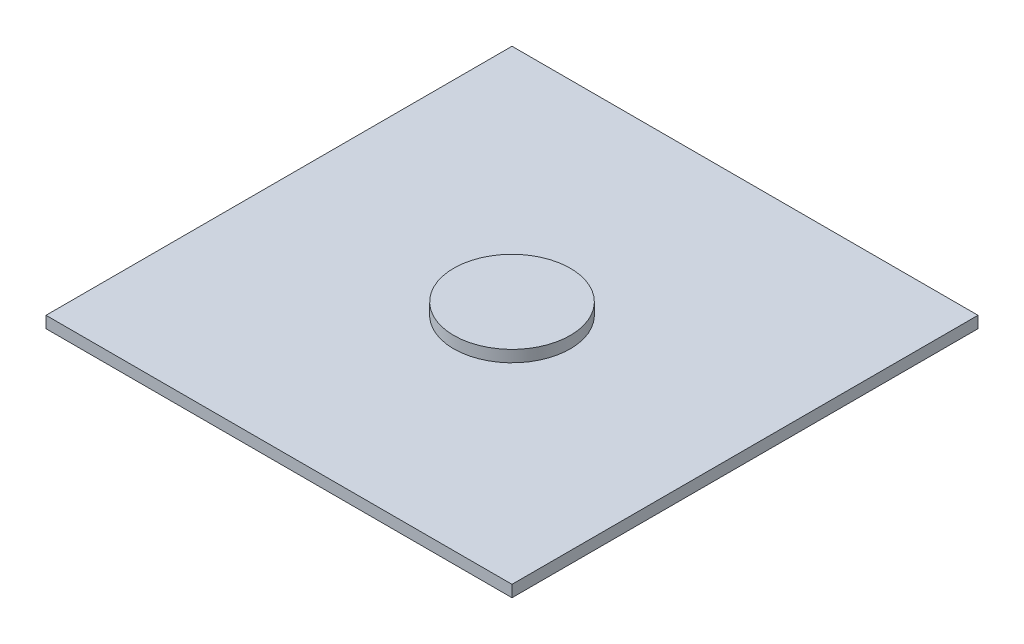
ISO-10303-21;
HEADER;
FILE_DESCRIPTION(('STEP AP214'),'2;1');
FILE_NAME('part.step','',(''),(''),'','','');
FILE_SCHEMA(('AUTOMOTIVE_DESIGN { 1 0 10303 214 1 1 1 1 }'));
ENDSEC;
DATA;
#1=APPLICATION_CONTEXT('core data for automotive mechanical design processes');
#2=APPLICATION_PROTOCOL_DEFINITION('international standard','automotive_design',2000,#1);
#3=PRODUCT_CONTEXT('',#1,'mechanical');
#4=PRODUCT('Part','Part','',(#3));
#5=PRODUCT_RELATED_PRODUCT_CATEGORY('part','',(#4));
#6=PRODUCT_DEFINITION_FORMATION('','',#4);
#7=PRODUCT_DEFINITION_CONTEXT('part definition',#1,'design');
#8=PRODUCT_DEFINITION('design','',#6,#7);
#9=PRODUCT_DEFINITION_SHAPE('','',#8);
#10=(LENGTH_UNIT() NAMED_UNIT(*) SI_UNIT(.MILLI.,.METRE.));
#11=(NAMED_UNIT(*) PLANE_ANGLE_UNIT() SI_UNIT($,.RADIAN.));
#12=(NAMED_UNIT(*) SI_UNIT($,.STERADIAN.) SOLID_ANGLE_UNIT());
#13=UNCERTAINTY_MEASURE_WITH_UNIT(LENGTH_MEASURE(1.E-05),#10,'distance_accuracy_value','');
#14=(GEOMETRIC_REPRESENTATION_CONTEXT(3) GLOBAL_UNCERTAINTY_ASSIGNED_CONTEXT((#13)) GLOBAL_UNIT_ASSIGNED_CONTEXT((#10,
#11,#12)) REPRESENTATION_CONTEXT('',''));
#15=CARTESIAN_POINT('',(0.,0.,0.));
#16=DIRECTION('',(0.,0.,1.));
#17=DIRECTION('',(1.,0.,0.));
#18=AXIS2_PLACEMENT_3D('',#15,#16,#17);
#19=CARTESIAN_POINT('',(0.,1.,0.));
#20=DIRECTION('',(1.,0.,0.));
#21=DIRECTION('',(0.,0.,-1.));
#22=AXIS2_PLACEMENT_3D('',#19,#20,#21);
#23=PLANE('',#22);
#24=DIRECTION('',(0.,0.,1.));
#25=VECTOR('',#24,1.);
#26=CARTESIAN_POINT('',(0.,0.,0.));
#27=LINE('',#26,#25);
#28=CARTESIAN_POINT('',(0.,0.,-40.));
#29=VERTEX_POINT('',#28);
#30=CARTESIAN_POINT('',(0.,0.,0.));
#31=VERTEX_POINT('',#30);
#32=EDGE_CURVE('E105',#29,#31,#27,.T.);
#33=ORIENTED_EDGE('',*,*,#32,.T.);
#34=DIRECTION('',(0.,-1.,0.));
#35=VECTOR('',#34,1.);
#36=CARTESIAN_POINT('',(0.,1.,0.));
#37=LINE('',#36,#35);
#38=CARTESIAN_POINT('',(0.,1.,0.));
#39=VERTEX_POINT('',#38);
#40=EDGE_CURVE('E42',#39,#31,#37,.T.);
#41=ORIENTED_EDGE('',*,*,#40,.F.);
#42=DIRECTION('',(0.,0.,1.));
#43=VECTOR('',#42,1.);
#44=CARTESIAN_POINT('',(0.,1.,0.));
#45=LINE('',#44,#43);
#46=CARTESIAN_POINT('',(0.,1.,-40.));
#47=VERTEX_POINT('',#46);
#48=EDGE_CURVE('E92',#47,#39,#45,.T.);
#49=ORIENTED_EDGE('',*,*,#48,.F.);
#50=DIRECTION('',(0.,-1.,0.));
#51=VECTOR('',#50,1.);
#52=CARTESIAN_POINT('',(0.,1.,-40.));
#53=LINE('',#52,#51);
#54=EDGE_CURVE('E101',#47,#29,#53,.T.);
#55=ORIENTED_EDGE('',*,*,#54,.T.);
#56=EDGE_LOOP('',(#33,#41,#49,#55));
#57=FACE_BOUND('',#56,.T.);
#58=ADVANCED_FACE('F39',(#57),#23,.F.);
#59=CARTESIAN_POINT('',(0.,1.,0.));
#60=DIRECTION('',(0.,0.,-1.));
#61=DIRECTION('',(-1.,0.,0.));
#62=AXIS2_PLACEMENT_3D('',#59,#60,#61);
#63=PLANE('',#62);
#64=DIRECTION('',(1.,0.,0.));
#65=VECTOR('',#64,1.);
#66=CARTESIAN_POINT('',(0.,0.,0.));
#67=LINE('',#66,#65);
#68=CARTESIAN_POINT('',(40.,0.,0.));
#69=VERTEX_POINT('',#68);
#70=EDGE_CURVE('E97',#31,#69,#67,.T.);
#71=ORIENTED_EDGE('',*,*,#70,.T.);
#72=DIRECTION('',(0.,-1.,0.));
#73=VECTOR('',#72,1.);
#74=CARTESIAN_POINT('',(40.,1.,0.));
#75=LINE('',#74,#73);
#76=CARTESIAN_POINT('',(40.,1.,0.));
#77=VERTEX_POINT('',#76);
#78=EDGE_CURVE('E95',#77,#69,#75,.T.);
#79=ORIENTED_EDGE('',*,*,#78,.F.);
#80=DIRECTION('',(1.,0.,0.));
#81=VECTOR('',#80,1.);
#82=CARTESIAN_POINT('',(0.,1.,0.));
#83=LINE('',#82,#81);
#84=EDGE_CURVE('E87',#39,#77,#83,.T.);
#85=ORIENTED_EDGE('',*,*,#84,.F.);
#86=ORIENTED_EDGE('',*,*,#40,.T.);
#87=EDGE_LOOP('',(#71,#79,#85,#86));
#88=FACE_BOUND('',#87,.T.);
#89=ADVANCED_FACE('F96',(#88),#63,.F.);
#90=CARTESIAN_POINT('',(40.,1.,0.));
#91=DIRECTION('',(-1.,0.,0.));
#92=DIRECTION('',(0.,0.,1.));
#93=AXIS2_PLACEMENT_3D('',#90,#91,#92);
#94=PLANE('',#93);
#95=DIRECTION('',(0.,0.,-1.));
#96=VECTOR('',#95,1.);
#97=CARTESIAN_POINT('',(40.,0.,0.));
#98=LINE('',#97,#96);
#99=CARTESIAN_POINT('',(40.,0.,-40.));
#100=VERTEX_POINT('',#99);
#101=EDGE_CURVE('E73',#69,#100,#98,.T.);
#102=ORIENTED_EDGE('',*,*,#101,.T.);
#103=DIRECTION('',(0.,-1.,0.));
#104=VECTOR('',#103,1.);
#105=CARTESIAN_POINT('',(40.,1.,-40.));
#106=LINE('',#105,#104);
#107=CARTESIAN_POINT('',(40.,1.,-40.));
#108=VERTEX_POINT('',#107);
#109=EDGE_CURVE('E98',#108,#100,#106,.T.);
#110=ORIENTED_EDGE('',*,*,#109,.F.);
#111=DIRECTION('',(0.,0.,-1.));
#112=VECTOR('',#111,1.);
#113=CARTESIAN_POINT('',(40.,1.,0.));
#114=LINE('',#113,#112);
#115=EDGE_CURVE('E90',#77,#108,#114,.T.);
#116=ORIENTED_EDGE('',*,*,#115,.F.);
#117=ORIENTED_EDGE('',*,*,#78,.T.);
#118=EDGE_LOOP('',(#102,#110,#116,#117));
#119=FACE_BOUND('',#118,.T.);
#120=ADVANCED_FACE('F99',(#119),#94,.F.);
#121=CARTESIAN_POINT('',(0.,1.,-40.));
#122=DIRECTION('',(0.,0.,1.));
#123=DIRECTION('',(1.,0.,0.));
#124=AXIS2_PLACEMENT_3D('',#121,#122,#123);
#125=PLANE('',#124);
#126=DIRECTION('',(-1.,0.,0.));
#127=VECTOR('',#126,1.);
#128=CARTESIAN_POINT('',(0.,0.,-40.));
#129=LINE('',#128,#127);
#130=EDGE_CURVE('E79',#100,#29,#129,.T.);
#131=ORIENTED_EDGE('',*,*,#130,.T.);
#132=ORIENTED_EDGE('',*,*,#54,.F.);
#133=DIRECTION('',(-1.,0.,0.));
#134=VECTOR('',#133,1.);
#135=CARTESIAN_POINT('',(0.,1.,-40.));
#136=LINE('',#135,#134);
#137=EDGE_CURVE('E56',#108,#47,#136,.T.);
#138=ORIENTED_EDGE('',*,*,#137,.F.);
#139=ORIENTED_EDGE('',*,*,#109,.T.);
#140=EDGE_LOOP('',(#131,#132,#138,#139));
#141=FACE_BOUND('',#140,.T.);
#142=ADVANCED_FACE('F113',(#141),#125,.F.);
#143=CARTESIAN_POINT('',(0.,1.,0.));
#144=DIRECTION('',(0.,-1.,0.));
#145=DIRECTION('',(0.,0.,-1.));
#146=AXIS2_PLACEMENT_3D('',#143,#144,#145);
#147=PLANE('',#146);
#148=CARTESIAN_POINT('',(20.,1.,-20.));
#149=DIRECTION('',(0.,1.,0.));
#150=DIRECTION('',(0.,0.,1.));
#151=AXIS2_PLACEMENT_3D('',#148,#149,#150);
#152=CIRCLE('',#151,5.);
#153=CARTESIAN_POINT('',(20.,1.,-15.));
#154=VERTEX_POINT('',#153);
#155=EDGE_CURVE('E11',#154,#154,#152,.T.);
#156=ORIENTED_EDGE('',*,*,#155,.F.);
#157=EDGE_LOOP('',(#156));
#158=FACE_BOUND('',#157,.T.);
#159=ORIENTED_EDGE('',*,*,#48,.T.);
#160=ORIENTED_EDGE('',*,*,#84,.T.);
#161=ORIENTED_EDGE('',*,*,#115,.T.);
#162=ORIENTED_EDGE('',*,*,#137,.T.);
#163=EDGE_LOOP('',(#159,#160,#161,#162));
#164=FACE_BOUND('',#163,.T.);
#165=ADVANCED_FACE('F88',(#158,#164),#147,.F.);
#166=CARTESIAN_POINT('',(0.,0.,0.));
#167=DIRECTION('',(0.,-1.,0.));
#168=DIRECTION('',(0.,0.,-1.));
#169=AXIS2_PLACEMENT_3D('',#166,#167,#168);
#170=PLANE('',#169);
#171=ORIENTED_EDGE('',*,*,#32,.F.);
#172=ORIENTED_EDGE('',*,*,#130,.F.);
#173=ORIENTED_EDGE('',*,*,#101,.F.);
#174=ORIENTED_EDGE('',*,*,#70,.F.);
#175=EDGE_LOOP('',(#171,#172,#173,#174));
#176=FACE_BOUND('',#175,.T.);
#177=ADVANCED_FACE('F116',(#176),#170,.T.);
#178=CARTESIAN_POINT('',(20.,2.,-20.));
#179=DIRECTION('',(0.,-1.,0.));
#180=DIRECTION('',(0.,0.,-1.));
#181=AXIS2_PLACEMENT_3D('',#178,#179,#180);
#182=CYLINDRICAL_SURFACE('',#181,5.);
#183=CARTESIAN_POINT('',(20.,2.,-20.));
#184=DIRECTION('',(0.,1.,0.));
#185=DIRECTION('',(0.,0.,1.));
#186=AXIS2_PLACEMENT_3D('',#183,#184,#185);
#187=CIRCLE('',#186,5.);
#188=CARTESIAN_POINT('',(20.,2.,-15.));
#189=VERTEX_POINT('',#188);
#190=EDGE_CURVE('E108',#189,#189,#187,.T.);
#191=ORIENTED_EDGE('',*,*,#190,.F.);
#192=EDGE_LOOP('',(#191));
#193=FACE_BOUND('',#192,.T.);
#194=ORIENTED_EDGE('',*,*,#155,.T.);
#195=EDGE_LOOP('',(#194));
#196=FACE_BOUND('',#195,.T.);
#197=ADVANCED_FACE('F124',(#193,#196),#182,.T.);
#198=CARTESIAN_POINT('',(20.,2.,-20.));
#199=DIRECTION('',(0.,1.,0.));
#200=DIRECTION('',(0.,0.,1.));
#201=AXIS2_PLACEMENT_3D('',#198,#199,#200);
#202=PLANE('',#201);
#203=ORIENTED_EDGE('',*,*,#190,.T.);
#204=EDGE_LOOP('',(#203));
#205=FACE_BOUND('',#204,.T.);
#206=ADVANCED_FACE('F122',(#205),#202,.T.);
#207=CLOSED_SHELL('',(#58,#89,#120,#142,#165,#177,#197,#206));
#208=MANIFOLD_SOLID_BREP('B2',#207);
#209=ADVANCED_BREP_SHAPE_REPRESENTATION('',(#18,#208),#14);
#210=SHAPE_DEFINITION_REPRESENTATION(#9,#209);
ENDSEC;
END-ISO-10303-21;
